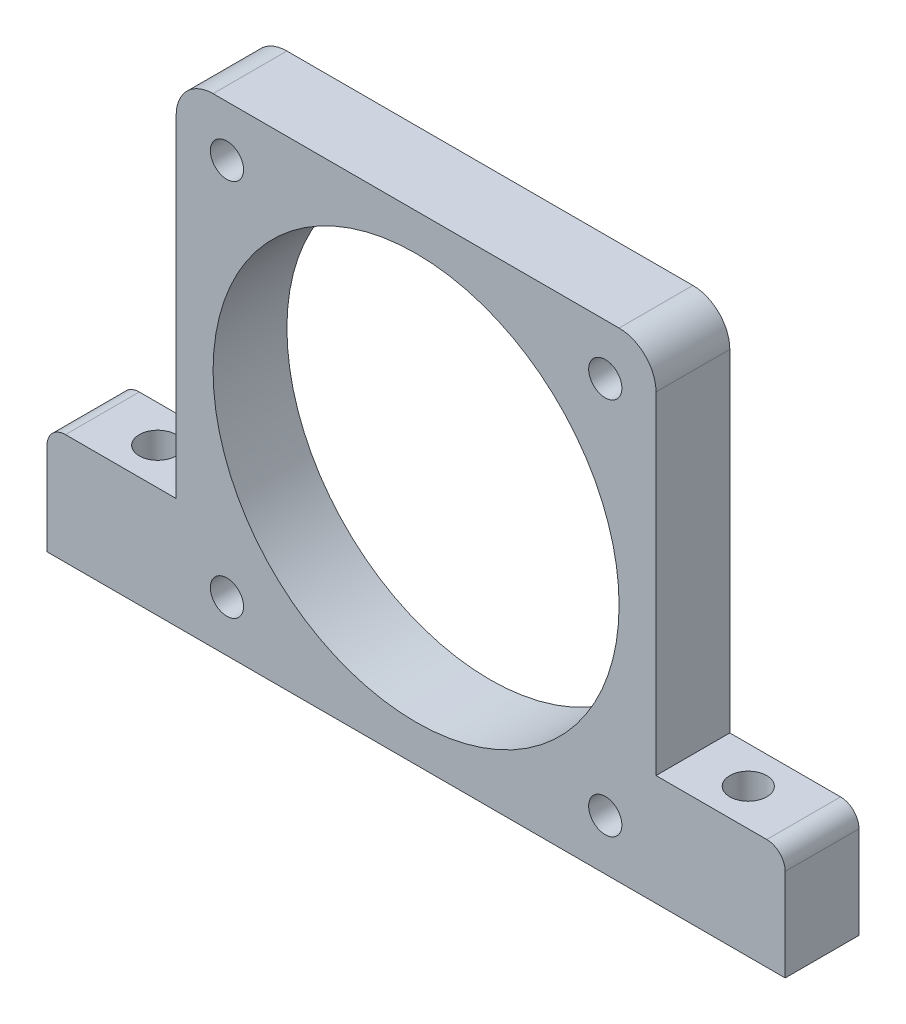
ISO-10303-21;
HEADER;
FILE_DESCRIPTION(('STEP AP214'),'2;1');
FILE_NAME('part.step','',(''),(''),'','','');
FILE_SCHEMA(('AUTOMOTIVE_DESIGN { 1 0 10303 214 1 1 1 1 }'));
ENDSEC;
DATA;
#1=APPLICATION_CONTEXT('core data for automotive mechanical design processes');
#2=APPLICATION_PROTOCOL_DEFINITION('international standard','automotive_design',2000,#1);
#3=PRODUCT_CONTEXT('',#1,'mechanical');
#4=PRODUCT('Part','Part','',(#3));
#5=PRODUCT_RELATED_PRODUCT_CATEGORY('part','',(#4));
#6=PRODUCT_DEFINITION_FORMATION('','',#4);
#7=PRODUCT_DEFINITION_CONTEXT('part definition',#1,'design');
#8=PRODUCT_DEFINITION('design','',#6,#7);
#9=PRODUCT_DEFINITION_SHAPE('','',#8);
#10=(LENGTH_UNIT() NAMED_UNIT(*) SI_UNIT(.MILLI.,.METRE.));
#11=(NAMED_UNIT(*) PLANE_ANGLE_UNIT() SI_UNIT($,.RADIAN.));
#12=(NAMED_UNIT(*) SI_UNIT($,.STERADIAN.) SOLID_ANGLE_UNIT());
#13=UNCERTAINTY_MEASURE_WITH_UNIT(LENGTH_MEASURE(1.E-05),#10,'distance_accuracy_value','');
#14=(GEOMETRIC_REPRESENTATION_CONTEXT(3) GLOBAL_UNCERTAINTY_ASSIGNED_CONTEXT((#13)) GLOBAL_UNIT_ASSIGNED_CONTEXT((#10,
#11,#12)) REPRESENTATION_CONTEXT('',''));
#15=CARTESIAN_POINT('',(0.,0.,0.));
#16=DIRECTION('',(0.,0.,1.));
#17=DIRECTION('',(1.,0.,0.));
#18=AXIS2_PLACEMENT_3D('',#15,#16,#17);
#19=CARTESIAN_POINT('',(65.,54.9999999999999,20.));
#20=DIRECTION('',(1.,0.,0.));
#21=DIRECTION('',(0.,1.,0.));
#22=AXIS2_PLACEMENT_3D('',#19,#20,#21);
#23=PLANE('',#22);
#24=DIRECTION('',(0.,-1.,0.));
#25=VECTOR('',#24,1.);
#26=CARTESIAN_POINT('',(65.,54.9999999999999,20.));
#27=LINE('',#26,#25);
#28=CARTESIAN_POINT('',(65.,54.9999999999999,20.));
#29=VERTEX_POINT('',#28);
#30=CARTESIAN_POINT('',(64.9999999999999,-35.,20.));
#31=VERTEX_POINT('',#30);
#32=EDGE_CURVE('E233',#29,#31,#27,.T.);
#33=ORIENTED_EDGE('',*,*,#32,.T.);
#34=DIRECTION('',(0.,0.,-1.));
#35=VECTOR('',#34,1.);
#36=CARTESIAN_POINT('',(64.9999999999999,-35.,20.));
#37=LINE('',#36,#35);
#38=CARTESIAN_POINT('',(64.9999999999999,-35.,0.));
#39=VERTEX_POINT('',#38);
#40=EDGE_CURVE('E178',#31,#39,#37,.T.);
#41=ORIENTED_EDGE('',*,*,#40,.T.);
#42=DIRECTION('',(0.,-1.,0.));
#43=VECTOR('',#42,1.);
#44=CARTESIAN_POINT('',(65.,54.9999999999999,0.));
#45=LINE('',#44,#43);
#46=CARTESIAN_POINT('',(65.,54.9999999999999,0.));
#47=VERTEX_POINT('',#46);
#48=EDGE_CURVE('E247',#47,#39,#45,.T.);
#49=ORIENTED_EDGE('',*,*,#48,.F.);
#50=DIRECTION('',(0.,0.,-1.));
#51=VECTOR('',#50,1.);
#52=CARTESIAN_POINT('',(65.,54.9999999999999,20.));
#53=LINE('',#52,#51);
#54=EDGE_CURVE('E45',#29,#47,#53,.T.);
#55=ORIENTED_EDGE('',*,*,#54,.F.);
#56=EDGE_LOOP('',(#33,#41,#49,#55));
#57=FACE_BOUND('',#56,.T.);
#58=ADVANCED_FACE('F36',(#57),#23,.T.);
#59=CARTESIAN_POINT('',(-55.,55.,20.));
#60=DIRECTION('',(0.,0.,-1.));
#61=DIRECTION('',(-1.,0.,0.));
#62=AXIS2_PLACEMENT_3D('',#59,#60,#61);
#63=CYLINDRICAL_SURFACE('',#62,10.);
#64=CARTESIAN_POINT('',(-55.,55.,0.));
#65=DIRECTION('',(0.,0.,-1.));
#66=DIRECTION('',(-1.,0.,0.));
#67=AXIS2_PLACEMENT_3D('',#64,#65,#66);
#68=CIRCLE('',#67,10.);
#69=CARTESIAN_POINT('',(-65.,55.,0.));
#70=VERTEX_POINT('',#69);
#71=CARTESIAN_POINT('',(-55.,65.,0.));
#72=VERTEX_POINT('',#71);
#73=EDGE_CURVE('E222',#70,#72,#68,.T.);
#74=ORIENTED_EDGE('',*,*,#73,.F.);
#75=DIRECTION('',(0.,0.,-1.));
#76=VECTOR('',#75,1.);
#77=CARTESIAN_POINT('',(-65.,55.,20.));
#78=LINE('',#77,#76);
#79=CARTESIAN_POINT('',(-65.,55.,20.));
#80=VERTEX_POINT('',#79);
#81=EDGE_CURVE('E11',#80,#70,#78,.T.);
#82=ORIENTED_EDGE('',*,*,#81,.F.);
#83=CARTESIAN_POINT('',(-55.,55.,20.));
#84=DIRECTION('',(0.,0.,-1.));
#85=DIRECTION('',(-1.,0.,0.));
#86=AXIS2_PLACEMENT_3D('',#83,#84,#85);
#87=CIRCLE('',#86,10.);
#88=CARTESIAN_POINT('',(-55.,65.,20.));
#89=VERTEX_POINT('',#88);
#90=EDGE_CURVE('E225',#80,#89,#87,.T.);
#91=ORIENTED_EDGE('',*,*,#90,.T.);
#92=DIRECTION('',(0.,0.,-1.));
#93=VECTOR('',#92,1.);
#94=CARTESIAN_POINT('',(-55.,65.,20.));
#95=LINE('',#94,#93);
#96=EDGE_CURVE('E40',#89,#72,#95,.T.);
#97=ORIENTED_EDGE('',*,*,#96,.T.);
#98=EDGE_LOOP('',(#74,#82,#91,#97));
#99=FACE_BOUND('',#98,.T.);
#100=ADVANCED_FACE('F38',(#99),#63,.T.);
#101=CARTESIAN_POINT('',(-65.,55.,20.));
#102=DIRECTION('',(1.,0.,0.));
#103=DIRECTION('',(0.,0.,-1.));
#104=AXIS2_PLACEMENT_3D('',#101,#102,#103);
#105=PLANE('',#104);
#106=DIRECTION('',(0.,-1.,0.));
#107=VECTOR('',#106,1.);
#108=CARTESIAN_POINT('',(-65.,55.,0.));
#109=LINE('',#108,#107);
#110=CARTESIAN_POINT('',(-65.,-35.,0.));
#111=VERTEX_POINT('',#110);
#112=EDGE_CURVE('E57',#70,#111,#109,.T.);
#113=ORIENTED_EDGE('',*,*,#112,.T.);
#114=DIRECTION('',(0.,0.,-1.));
#115=VECTOR('',#114,1.);
#116=CARTESIAN_POINT('',(-64.9999999999999,-35.,20.));
#117=LINE('',#116,#115);
#118=CARTESIAN_POINT('',(-65.,-35.,20.));
#119=VERTEX_POINT('',#118);
#120=EDGE_CURVE('E53',#119,#111,#117,.T.);
#121=ORIENTED_EDGE('',*,*,#120,.F.);
#122=DIRECTION('',(0.,-1.,0.));
#123=VECTOR('',#122,1.);
#124=CARTESIAN_POINT('',(-65.,55.,20.));
#125=LINE('',#124,#123);
#126=EDGE_CURVE('E144',#80,#119,#125,.T.);
#127=ORIENTED_EDGE('',*,*,#126,.F.);
#128=ORIENTED_EDGE('',*,*,#81,.T.);
#129=EDGE_LOOP('',(#113,#121,#127,#128));
#130=FACE_BOUND('',#129,.T.);
#131=ADVANCED_FACE('F298',(#130),#105,.F.);
#132=CARTESIAN_POINT('',(-65.,-65.,20.));
#133=DIRECTION('',(0.,1.,0.));
#134=DIRECTION('',(-1.,0.,0.));
#135=AXIS2_PLACEMENT_3D('',#132,#133,#134);
#136=PLANE('',#135);
#137=CARTESIAN_POINT('',(-79.9999999999999,-65.,10.));
#138=DIRECTION('',(0.,-1.,0.));
#139=DIRECTION('',(1.,0.,0.));
#140=AXIS2_PLACEMENT_3D('',#137,#138,#139);
#141=CIRCLE('',#140,5.);
#142=CARTESIAN_POINT('',(-84.9999999999999,-65.0000000000001,10.));
#143=VERTEX_POINT('',#142);
#144=EDGE_CURVE('E156',#143,#143,#141,.T.);
#145=ORIENTED_EDGE('',*,*,#144,.F.);
#146=EDGE_LOOP('',(#145));
#147=FACE_BOUND('',#146,.T.);
#148=CARTESIAN_POINT('',(79.9999999999999,-65.,10.));
#149=DIRECTION('',(0.,1.,0.));
#150=DIRECTION('',(-1.,0.,0.));
#151=AXIS2_PLACEMENT_3D('',#148,#149,#150);
#152=CIRCLE('',#151,5.);
#153=CARTESIAN_POINT('',(74.9999999999999,-65.,10.));
#154=VERTEX_POINT('',#153);
#155=EDGE_CURVE('E165',#154,#154,#152,.T.);
#156=ORIENTED_EDGE('',*,*,#155,.T.);
#157=EDGE_LOOP('',(#156));
#158=FACE_BOUND('',#157,.T.);
#159=DIRECTION('',(1.,0.,0.));
#160=VECTOR('',#159,1.);
#161=CARTESIAN_POINT('',(-65.,-65.,0.));
#162=LINE('',#161,#160);
#163=CARTESIAN_POINT('',(-99.9999999999999,-65.,0.));
#164=VERTEX_POINT('',#163);
#165=CARTESIAN_POINT('',(99.9999999999999,-65.,0.));
#166=VERTEX_POINT('',#165);
#167=EDGE_CURVE('E250',#164,#166,#162,.T.);
#168=ORIENTED_EDGE('',*,*,#167,.T.);
#169=DIRECTION('',(0.,0.,-1.));
#170=VECTOR('',#169,1.);
#171=CARTESIAN_POINT('',(99.9999999999999,-65.,20.));
#172=LINE('',#171,#170);
#173=CARTESIAN_POINT('',(99.9999999999999,-65.,20.));
#174=VERTEX_POINT('',#173);
#175=EDGE_CURVE('E191',#174,#166,#172,.T.);
#176=ORIENTED_EDGE('',*,*,#175,.F.);
#177=DIRECTION('',(1.,0.,0.));
#178=VECTOR('',#177,1.);
#179=CARTESIAN_POINT('',(-65.,-65.,20.));
#180=LINE('',#179,#178);
#181=CARTESIAN_POINT('',(-99.9999999999999,-65.,20.));
#182=VERTEX_POINT('',#181);
#183=EDGE_CURVE('E236',#182,#174,#180,.T.);
#184=ORIENTED_EDGE('',*,*,#183,.F.);
#185=DIRECTION('',(0.,0.,-1.));
#186=VECTOR('',#185,1.);
#187=CARTESIAN_POINT('',(-99.9999999999999,-65.,20.));
#188=LINE('',#187,#186);
#189=EDGE_CURVE('E150',#182,#164,#188,.T.);
#190=ORIENTED_EDGE('',*,*,#189,.T.);
#191=EDGE_LOOP('',(#168,#176,#184,#190));
#192=FACE_BOUND('',#191,.T.);
#193=ADVANCED_FACE('F273',(#147,#158,#192),#136,.F.);
#194=CARTESIAN_POINT('',(55.,55.,20.));
#195=DIRECTION('',(0.,0.,-1.));
#196=DIRECTION('',(-1.,0.,0.));
#197=AXIS2_PLACEMENT_3D('',#194,#195,#196);
#198=CYLINDRICAL_SURFACE('',#197,9.99999999999999);
#199=CARTESIAN_POINT('',(55.,55.,0.));
#200=DIRECTION('',(0.,0.,1.));
#201=DIRECTION('',(1.,0.,0.));
#202=AXIS2_PLACEMENT_3D('',#199,#200,#201);
#203=CIRCLE('',#202,9.99999999999999);
#204=CARTESIAN_POINT('',(54.9999999999999,65.,0.));
#205=VERTEX_POINT('',#204);
#206=EDGE_CURVE('E244',#47,#205,#203,.T.);
#207=ORIENTED_EDGE('',*,*,#206,.T.);
#208=DIRECTION('',(0.,0.,-1.));
#209=VECTOR('',#208,1.);
#210=CARTESIAN_POINT('',(54.9999999999999,65.,20.));
#211=LINE('',#210,#209);
#212=CARTESIAN_POINT('',(54.9999999999999,65.,20.));
#213=VERTEX_POINT('',#212);
#214=EDGE_CURVE('E253',#213,#205,#211,.T.);
#215=ORIENTED_EDGE('',*,*,#214,.F.);
#216=CARTESIAN_POINT('',(55.,55.,20.));
#217=DIRECTION('',(0.,0.,1.));
#218=DIRECTION('',(1.,0.,0.));
#219=AXIS2_PLACEMENT_3D('',#216,#217,#218);
#220=CIRCLE('',#219,9.99999999999999);
#221=EDGE_CURVE('E231',#29,#213,#220,.T.);
#222=ORIENTED_EDGE('',*,*,#221,.F.);
#223=ORIENTED_EDGE('',*,*,#54,.T.);
#224=EDGE_LOOP('',(#207,#215,#222,#223));
#225=FACE_BOUND('',#224,.T.);
#226=ADVANCED_FACE('F291',(#225),#198,.T.);
#227=CARTESIAN_POINT('',(-55.,65.,20.));
#228=DIRECTION('',(0.,1.,0.));
#229=DIRECTION('',(-1.,0.,0.));
#230=AXIS2_PLACEMENT_3D('',#227,#228,#229);
#231=PLANE('',#230);
#232=DIRECTION('',(1.,0.,0.));
#233=VECTOR('',#232,1.);
#234=CARTESIAN_POINT('',(-55.,65.,0.));
#235=LINE('',#234,#233);
#236=EDGE_CURVE('E241',#72,#205,#235,.T.);
#237=ORIENTED_EDGE('',*,*,#236,.F.);
#238=ORIENTED_EDGE('',*,*,#96,.F.);
#239=DIRECTION('',(1.,0.,0.));
#240=VECTOR('',#239,1.);
#241=CARTESIAN_POINT('',(-55.,65.,20.));
#242=LINE('',#241,#240);
#243=EDGE_CURVE('E228',#89,#213,#242,.T.);
#244=ORIENTED_EDGE('',*,*,#243,.T.);
#245=ORIENTED_EDGE('',*,*,#214,.T.);
#246=EDGE_LOOP('',(#237,#238,#244,#245));
#247=FACE_BOUND('',#246,.T.);
#248=ADVANCED_FACE('F260',(#247),#231,.T.);
#249=CARTESIAN_POINT('',(-55.,55.,20.));
#250=DIRECTION('',(0.,0.,-1.));
#251=DIRECTION('',(-1.,0.,0.));
#252=AXIS2_PLACEMENT_3D('',#249,#250,#251);
#253=PLANE('',#252);
#254=CARTESIAN_POINT('',(0.,0.,20.));
#255=DIRECTION('',(0.,0.,1.));
#256=DIRECTION('',(1.,0.,0.));
#257=AXIS2_PLACEMENT_3D('',#254,#255,#256);
#258=CIRCLE('',#257,55.);
#259=CARTESIAN_POINT('',(55.,0.,20.));
#260=VERTEX_POINT('',#259);
#261=EDGE_CURVE('E195',#260,#260,#258,.T.);
#262=ORIENTED_EDGE('',*,*,#261,.F.);
#263=EDGE_LOOP('',(#262));
#264=FACE_BOUND('',#263,.T.);
#265=CARTESIAN_POINT('',(51.25,-51.25,20.));
#266=DIRECTION('',(0.,0.,-1.));
#267=DIRECTION('',(1.,0.,0.));
#268=AXIS2_PLACEMENT_3D('',#265,#266,#267);
#269=CIRCLE('',#268,4.50000000000001);
#270=CARTESIAN_POINT('',(55.75,-51.25,20.));
#271=VERTEX_POINT('',#270);
#272=EDGE_CURVE('E201',#271,#271,#269,.T.);
#273=ORIENTED_EDGE('',*,*,#272,.T.);
#274=EDGE_LOOP('',(#273));
#275=FACE_BOUND('',#274,.T.);
#276=CARTESIAN_POINT('',(-51.25,-51.25,20.));
#277=DIRECTION('',(0.,0.,1.));
#278=DIRECTION('',(-1.,0.,0.));
#279=AXIS2_PLACEMENT_3D('',#276,#277,#278);
#280=CIRCLE('',#279,4.50000000000001);
#281=CARTESIAN_POINT('',(-55.75,-51.25,20.));
#282=VERTEX_POINT('',#281);
#283=EDGE_CURVE('E207',#282,#282,#280,.T.);
#284=ORIENTED_EDGE('',*,*,#283,.F.);
#285=EDGE_LOOP('',(#284));
#286=FACE_BOUND('',#285,.T.);
#287=CARTESIAN_POINT('',(-51.25,51.25,20.));
#288=DIRECTION('',(0.,0.,-1.));
#289=DIRECTION('',(-1.,0.,0.));
#290=AXIS2_PLACEMENT_3D('',#287,#288,#289);
#291=CIRCLE('',#290,4.50000000000001);
#292=CARTESIAN_POINT('',(-55.75,51.25,20.));
#293=VERTEX_POINT('',#292);
#294=EDGE_CURVE('E213',#293,#293,#291,.T.);
#295=ORIENTED_EDGE('',*,*,#294,.T.);
#296=EDGE_LOOP('',(#295));
#297=FACE_BOUND('',#296,.T.);
#298=CARTESIAN_POINT('',(51.25,51.25,20.));
#299=DIRECTION('',(0.,0.,1.));
#300=DIRECTION('',(1.,0.,0.));
#301=AXIS2_PLACEMENT_3D('',#298,#299,#300);
#302=CIRCLE('',#301,4.50000000000001);
#303=CARTESIAN_POINT('',(55.75,51.25,20.));
#304=VERTEX_POINT('',#303);
#305=EDGE_CURVE('E219',#304,#304,#302,.T.);
#306=ORIENTED_EDGE('',*,*,#305,.F.);
#307=EDGE_LOOP('',(#306));
#308=FACE_BOUND('',#307,.T.);
#309=ORIENTED_EDGE('',*,*,#90,.F.);
#310=ORIENTED_EDGE('',*,*,#126,.T.);
#311=DIRECTION('',(1.,0.,0.));
#312=VECTOR('',#311,1.);
#313=CARTESIAN_POINT('',(-64.9999999999999,-35.,20.));
#314=LINE('',#313,#312);
#315=CARTESIAN_POINT('',(-94.9999999999999,-35.,20.));
#316=VERTEX_POINT('',#315);
#317=EDGE_CURVE('E128',#316,#119,#314,.T.);
#318=ORIENTED_EDGE('',*,*,#317,.F.);
#319=CARTESIAN_POINT('',(-94.9999999999999,-40.,20.));
#320=DIRECTION('',(0.,0.,-1.));
#321=DIRECTION('',(-1.,0.,0.));
#322=AXIS2_PLACEMENT_3D('',#319,#320,#321);
#323=CIRCLE('',#322,5.00000000000001);
#324=CARTESIAN_POINT('',(-99.9999999999999,-40.,20.));
#325=VERTEX_POINT('',#324);
#326=EDGE_CURVE('E142',#325,#316,#323,.T.);
#327=ORIENTED_EDGE('',*,*,#326,.F.);
#328=DIRECTION('',(0.,1.,0.));
#329=VECTOR('',#328,1.);
#330=CARTESIAN_POINT('',(-99.9999999999999,-65.,20.));
#331=LINE('',#330,#329);
#332=EDGE_CURVE('E148',#182,#325,#331,.T.);
#333=ORIENTED_EDGE('',*,*,#332,.F.);
#334=ORIENTED_EDGE('',*,*,#183,.T.);
#335=DIRECTION('',(0.,1.,0.));
#336=VECTOR('',#335,1.);
#337=CARTESIAN_POINT('',(99.9999999999999,-65.,20.));
#338=LINE('',#337,#336);
#339=CARTESIAN_POINT('',(99.9999999999999,-40.,20.));
#340=VERTEX_POINT('',#339);
#341=EDGE_CURVE('E171',#174,#340,#338,.T.);
#342=ORIENTED_EDGE('',*,*,#341,.T.);
#343=CARTESIAN_POINT('',(94.9999999999999,-40.,20.));
#344=DIRECTION('',(0.,0.,1.));
#345=DIRECTION('',(1.,0.,0.));
#346=AXIS2_PLACEMENT_3D('',#343,#344,#345);
#347=CIRCLE('',#346,5.00000000000001);
#348=CARTESIAN_POINT('',(94.9999999999999,-35.,20.));
#349=VERTEX_POINT('',#348);
#350=EDGE_CURVE('E173',#340,#349,#347,.T.);
#351=ORIENTED_EDGE('',*,*,#350,.T.);
#352=DIRECTION('',(-1.,0.,0.));
#353=VECTOR('',#352,1.);
#354=CARTESIAN_POINT('',(64.9999999999999,-35.,20.));
#355=LINE('',#354,#353);
#356=EDGE_CURVE('E176',#349,#31,#355,.T.);
#357=ORIENTED_EDGE('',*,*,#356,.T.);
#358=ORIENTED_EDGE('',*,*,#32,.F.);
#359=ORIENTED_EDGE('',*,*,#221,.T.);
#360=ORIENTED_EDGE('',*,*,#243,.F.);
#361=EDGE_LOOP('',(#309,#310,#318,#327,#333,#334,#342,#351,#357,#358,#359,#360));
#362=FACE_BOUND('',#361,.T.);
#363=ADVANCED_FACE('F140',(#264,#275,#286,#297,#308,#362),#253,.F.);
#364=CARTESIAN_POINT('',(-55.,55.,0.));
#365=DIRECTION('',(0.,0.,-1.));
#366=DIRECTION('',(-1.,0.,0.));
#367=AXIS2_PLACEMENT_3D('',#364,#365,#366);
#368=PLANE('',#367);
#369=CARTESIAN_POINT('',(-59.84,-48.46,0.));
#370=DIRECTION('',(0.,0.,-1.));
#371=DIRECTION('',(-1.,0.,0.));
#372=AXIS2_PLACEMENT_3D('',#369,#370,#371);
#373=CIRCLE('',#372,2.5);
#374=CARTESIAN_POINT('',(-62.34,-48.46,0.));
#375=VERTEX_POINT('',#374);
#376=EDGE_CURVE('E378',#375,#375,#373,.T.);
#377=ORIENTED_EDGE('',*,*,#376,.F.);
#378=EDGE_LOOP('',(#377));
#379=FACE_BOUND('',#378,.T.);
#380=CARTESIAN_POINT('',(59.84,48.46,0.));
#381=DIRECTION('',(0.,0.,-1.));
#382=DIRECTION('',(-1.,0.,0.));
#383=AXIS2_PLACEMENT_3D('',#380,#381,#382);
#384=CIRCLE('',#383,2.5);
#385=CARTESIAN_POINT('',(57.34,48.46,0.));
#386=VERTEX_POINT('',#385);
#387=EDGE_CURVE('E387',#386,#386,#384,.T.);
#388=ORIENTED_EDGE('',*,*,#387,.F.);
#389=EDGE_LOOP('',(#388));
#390=FACE_BOUND('',#389,.T.);
#391=CARTESIAN_POINT('',(0.,0.,0.));
#392=DIRECTION('',(0.,0.,1.));
#393=DIRECTION('',(1.,0.,0.));
#394=AXIS2_PLACEMENT_3D('',#391,#392,#393);
#395=CIRCLE('',#394,55.);
#396=CARTESIAN_POINT('',(55.,0.,0.));
#397=VERTEX_POINT('',#396);
#398=EDGE_CURVE('E194',#397,#397,#395,.T.);
#399=ORIENTED_EDGE('',*,*,#398,.T.);
#400=EDGE_LOOP('',(#399));
#401=FACE_BOUND('',#400,.T.);
#402=CARTESIAN_POINT('',(51.25,-51.25,0.));
#403=DIRECTION('',(0.,0.,-1.));
#404=DIRECTION('',(1.,0.,0.));
#405=AXIS2_PLACEMENT_3D('',#402,#403,#404);
#406=CIRCLE('',#405,4.50000000000001);
#407=CARTESIAN_POINT('',(55.75,-51.25,0.));
#408=VERTEX_POINT('',#407);
#409=EDGE_CURVE('E198',#408,#408,#406,.T.);
#410=ORIENTED_EDGE('',*,*,#409,.F.);
#411=EDGE_LOOP('',(#410));
#412=FACE_BOUND('',#411,.T.);
#413=CARTESIAN_POINT('',(-51.25,-51.25,0.));
#414=DIRECTION('',(0.,0.,1.));
#415=DIRECTION('',(-1.,0.,0.));
#416=AXIS2_PLACEMENT_3D('',#413,#414,#415);
#417=CIRCLE('',#416,4.50000000000001);
#418=CARTESIAN_POINT('',(-55.75,-51.25,0.));
#419=VERTEX_POINT('',#418);
#420=EDGE_CURVE('E204',#419,#419,#417,.T.);
#421=ORIENTED_EDGE('',*,*,#420,.T.);
#422=EDGE_LOOP('',(#421));
#423=FACE_BOUND('',#422,.T.);
#424=CARTESIAN_POINT('',(-51.25,51.25,0.));
#425=DIRECTION('',(0.,0.,-1.));
#426=DIRECTION('',(-1.,0.,0.));
#427=AXIS2_PLACEMENT_3D('',#424,#425,#426);
#428=CIRCLE('',#427,4.50000000000001);
#429=CARTESIAN_POINT('',(-55.75,51.25,0.));
#430=VERTEX_POINT('',#429);
#431=EDGE_CURVE('E210',#430,#430,#428,.T.);
#432=ORIENTED_EDGE('',*,*,#431,.F.);
#433=EDGE_LOOP('',(#432));
#434=FACE_BOUND('',#433,.T.);
#435=CARTESIAN_POINT('',(51.25,51.25,0.));
#436=DIRECTION('',(0.,0.,1.));
#437=DIRECTION('',(1.,0.,0.));
#438=AXIS2_PLACEMENT_3D('',#435,#436,#437);
#439=CIRCLE('',#438,4.50000000000001);
#440=CARTESIAN_POINT('',(55.75,51.25,0.));
#441=VERTEX_POINT('',#440);
#442=EDGE_CURVE('E216',#441,#441,#439,.T.);
#443=ORIENTED_EDGE('',*,*,#442,.T.);
#444=EDGE_LOOP('',(#443));
#445=FACE_BOUND('',#444,.T.);
#446=ORIENTED_EDGE('',*,*,#73,.T.);
#447=ORIENTED_EDGE('',*,*,#236,.T.);
#448=ORIENTED_EDGE('',*,*,#206,.F.);
#449=ORIENTED_EDGE('',*,*,#48,.T.);
#450=DIRECTION('',(-1.,0.,0.));
#451=VECTOR('',#450,1.);
#452=CARTESIAN_POINT('',(64.9999999999999,-35.,0.));
#453=LINE('',#452,#451);
#454=CARTESIAN_POINT('',(94.9999999999999,-35.,0.));
#455=VERTEX_POINT('',#454);
#456=EDGE_CURVE('E174',#455,#39,#453,.T.);
#457=ORIENTED_EDGE('',*,*,#456,.F.);
#458=CARTESIAN_POINT('',(94.9999999999999,-40.,0.));
#459=DIRECTION('',(0.,0.,1.));
#460=DIRECTION('',(1.,0.,0.));
#461=AXIS2_PLACEMENT_3D('',#458,#459,#460);
#462=CIRCLE('',#461,5.00000000000001);
#463=CARTESIAN_POINT('',(99.9999999999999,-40.,0.));
#464=VERTEX_POINT('',#463);
#465=EDGE_CURVE('E180',#464,#455,#462,.T.);
#466=ORIENTED_EDGE('',*,*,#465,.F.);
#467=DIRECTION('',(0.,1.,0.));
#468=VECTOR('',#467,1.);
#469=CARTESIAN_POINT('',(99.9999999999999,-65.,0.));
#470=LINE('',#469,#468);
#471=EDGE_CURVE('E168',#166,#464,#470,.T.);
#472=ORIENTED_EDGE('',*,*,#471,.F.);
#473=ORIENTED_EDGE('',*,*,#167,.F.);
#474=DIRECTION('',(0.,1.,0.));
#475=VECTOR('',#474,1.);
#476=CARTESIAN_POINT('',(-99.9999999999999,-65.,0.));
#477=LINE('',#476,#475);
#478=CARTESIAN_POINT('',(-99.9999999999999,-40.,0.));
#479=VERTEX_POINT('',#478);
#480=EDGE_CURVE('E145',#164,#479,#477,.T.);
#481=ORIENTED_EDGE('',*,*,#480,.T.);
#482=CARTESIAN_POINT('',(-94.9999999999999,-40.,0.));
#483=DIRECTION('',(0.,0.,-1.));
#484=DIRECTION('',(-1.,0.,0.));
#485=AXIS2_PLACEMENT_3D('',#482,#483,#484);
#486=CIRCLE('',#485,5.00000000000001);
#487=CARTESIAN_POINT('',(-94.9999999999999,-35.,0.));
#488=VERTEX_POINT('',#487);
#489=EDGE_CURVE('E155',#479,#488,#486,.T.);
#490=ORIENTED_EDGE('',*,*,#489,.T.);
#491=DIRECTION('',(1.,0.,0.));
#492=VECTOR('',#491,1.);
#493=CARTESIAN_POINT('',(-64.9999999999999,-35.,0.));
#494=LINE('',#493,#492);
#495=EDGE_CURVE('E130',#488,#111,#494,.T.);
#496=ORIENTED_EDGE('',*,*,#495,.T.);
#497=ORIENTED_EDGE('',*,*,#112,.F.);
#498=EDGE_LOOP('',(#446,#447,#448,#449,#457,#466,#472,#473,#481,#490,#496,#497));
#499=FACE_BOUND('',#498,.T.);
#500=ADVANCED_FACE('F263',(#379,#390,#401,#412,#423,#434,#445,#499),#368,.T.);
#501=CARTESIAN_POINT('',(51.25,51.25,20.));
#502=DIRECTION('',(0.,0.,-1.));
#503=DIRECTION('',(-1.,0.,0.));
#504=AXIS2_PLACEMENT_3D('',#501,#502,#503);
#505=CYLINDRICAL_SURFACE('',#504,4.50000000000001);
#506=ORIENTED_EDGE('',*,*,#305,.T.);
#507=EDGE_LOOP('',(#506));
#508=FACE_BOUND('',#507,.T.);
#509=ORIENTED_EDGE('',*,*,#442,.F.);
#510=EDGE_LOOP('',(#509));
#511=FACE_BOUND('',#510,.T.);
#512=ADVANCED_FACE('F311',(#508,#511),#505,.F.);
#513=CARTESIAN_POINT('',(-51.25,51.25,20.));
#514=DIRECTION('',(0.,0.,-1.));
#515=DIRECTION('',(-1.,0.,0.));
#516=AXIS2_PLACEMENT_3D('',#513,#514,#515);
#517=CYLINDRICAL_SURFACE('',#516,4.50000000000001);
#518=ORIENTED_EDGE('',*,*,#294,.F.);
#519=EDGE_LOOP('',(#518));
#520=FACE_BOUND('',#519,.T.);
#521=ORIENTED_EDGE('',*,*,#431,.T.);
#522=EDGE_LOOP('',(#521));
#523=FACE_BOUND('',#522,.T.);
#524=ADVANCED_FACE('F318',(#520,#523),#517,.F.);
#525=CARTESIAN_POINT('',(-51.25,-51.25,20.));
#526=DIRECTION('',(0.,0.,-1.));
#527=DIRECTION('',(-1.,0.,0.));
#528=AXIS2_PLACEMENT_3D('',#525,#526,#527);
#529=CYLINDRICAL_SURFACE('',#528,4.50000000000001);
#530=ORIENTED_EDGE('',*,*,#283,.T.);
#531=EDGE_LOOP('',(#530));
#532=FACE_BOUND('',#531,.T.);
#533=ORIENTED_EDGE('',*,*,#420,.F.);
#534=EDGE_LOOP('',(#533));
#535=FACE_BOUND('',#534,.T.);
#536=ADVANCED_FACE('F322',(#532,#535),#529,.F.);
#537=CARTESIAN_POINT('',(51.25,-51.25,20.));
#538=DIRECTION('',(0.,0.,-1.));
#539=DIRECTION('',(-1.,0.,0.));
#540=AXIS2_PLACEMENT_3D('',#537,#538,#539);
#541=CYLINDRICAL_SURFACE('',#540,4.50000000000001);
#542=ORIENTED_EDGE('',*,*,#272,.F.);
#543=EDGE_LOOP('',(#542));
#544=FACE_BOUND('',#543,.T.);
#545=ORIENTED_EDGE('',*,*,#409,.T.);
#546=EDGE_LOOP('',(#545));
#547=FACE_BOUND('',#546,.T.);
#548=ADVANCED_FACE('F326',(#544,#547),#541,.F.);
#549=CARTESIAN_POINT('',(0.,0.,20.));
#550=DIRECTION('',(0.,0.,-1.));
#551=DIRECTION('',(-1.,0.,0.));
#552=AXIS2_PLACEMENT_3D('',#549,#550,#551);
#553=CYLINDRICAL_SURFACE('',#552,55.);
#554=ORIENTED_EDGE('',*,*,#261,.T.);
#555=EDGE_LOOP('',(#554));
#556=FACE_BOUND('',#555,.T.);
#557=ORIENTED_EDGE('',*,*,#398,.F.);
#558=EDGE_LOOP('',(#557));
#559=FACE_BOUND('',#558,.T.);
#560=ADVANCED_FACE('F330',(#556,#559),#553,.F.);
#561=CARTESIAN_POINT('',(99.9999999999999,-65.,20.));
#562=DIRECTION('',(-1.,0.,0.));
#563=DIRECTION('',(0.,-1.,0.));
#564=AXIS2_PLACEMENT_3D('',#561,#562,#563);
#565=PLANE('',#564);
#566=ORIENTED_EDGE('',*,*,#471,.T.);
#567=DIRECTION('',(0.,0.,-1.));
#568=VECTOR('',#567,1.);
#569=CARTESIAN_POINT('',(99.9999999999999,-40.,20.));
#570=LINE('',#569,#568);
#571=EDGE_CURVE('E188',#340,#464,#570,.T.);
#572=ORIENTED_EDGE('',*,*,#571,.F.);
#573=ORIENTED_EDGE('',*,*,#341,.F.);
#574=ORIENTED_EDGE('',*,*,#175,.T.);
#575=EDGE_LOOP('',(#566,#572,#573,#574));
#576=FACE_BOUND('',#575,.T.);
#577=ADVANCED_FACE('F275',(#576),#565,.F.);
#578=CARTESIAN_POINT('',(94.9999999999999,-40.,20.));
#579=DIRECTION('',(0.,0.,-1.));
#580=DIRECTION('',(-1.,0.,0.));
#581=AXIS2_PLACEMENT_3D('',#578,#579,#580);
#582=CYLINDRICAL_SURFACE('',#581,5.00000000000001);
#583=ORIENTED_EDGE('',*,*,#465,.T.);
#584=DIRECTION('',(0.,0.,-1.));
#585=VECTOR('',#584,1.);
#586=CARTESIAN_POINT('',(94.9999999999999,-35.,20.));
#587=LINE('',#586,#585);
#588=EDGE_CURVE('E185',#349,#455,#587,.T.);
#589=ORIENTED_EDGE('',*,*,#588,.F.);
#590=ORIENTED_EDGE('',*,*,#350,.F.);
#591=ORIENTED_EDGE('',*,*,#571,.T.);
#592=EDGE_LOOP('',(#583,#589,#590,#591));
#593=FACE_BOUND('',#592,.T.);
#594=ADVANCED_FACE('F280',(#593),#582,.T.);
#595=CARTESIAN_POINT('',(64.9999999999999,-35.,20.));
#596=DIRECTION('',(0.,-1.,0.));
#597=DIRECTION('',(0.,0.,-1.));
#598=AXIS2_PLACEMENT_3D('',#595,#596,#597);
#599=PLANE('',#598);
#600=CARTESIAN_POINT('',(79.9999999999999,-35.,10.));
#601=DIRECTION('',(0.,1.,0.));
#602=DIRECTION('',(-1.,0.,0.));
#603=AXIS2_PLACEMENT_3D('',#600,#601,#602);
#604=CIRCLE('',#603,5.);
#605=CARTESIAN_POINT('',(74.9999999999999,-35.,10.));
#606=VERTEX_POINT('',#605);
#607=EDGE_CURVE('E164',#606,#606,#604,.T.);
#608=ORIENTED_EDGE('',*,*,#607,.F.);
#609=EDGE_LOOP('',(#608));
#610=FACE_BOUND('',#609,.T.);
#611=ORIENTED_EDGE('',*,*,#456,.T.);
#612=ORIENTED_EDGE('',*,*,#40,.F.);
#613=ORIENTED_EDGE('',*,*,#356,.F.);
#614=ORIENTED_EDGE('',*,*,#588,.T.);
#615=EDGE_LOOP('',(#611,#612,#613,#614));
#616=FACE_BOUND('',#615,.T.);
#617=ADVANCED_FACE('F285',(#610,#616),#599,.F.);
#618=CARTESIAN_POINT('',(79.9999999999999,-65.,10.));
#619=DIRECTION('',(0.,1.,0.));
#620=DIRECTION('',(-1.,0.,0.));
#621=AXIS2_PLACEMENT_3D('',#618,#619,#620);
#622=CYLINDRICAL_SURFACE('',#621,5.);
#623=ORIENTED_EDGE('',*,*,#155,.F.);
#624=EDGE_LOOP('',(#623));
#625=FACE_BOUND('',#624,.T.);
#626=ORIENTED_EDGE('',*,*,#607,.T.);
#627=EDGE_LOOP('',(#626));
#628=FACE_BOUND('',#627,.T.);
#629=ADVANCED_FACE('F341',(#625,#628),#622,.F.);
#630=CARTESIAN_POINT('',(-64.9999999999999,-35.,20.));
#631=DIRECTION('',(0.,1.,0.));
#632=DIRECTION('',(-1.,0.,0.));
#633=AXIS2_PLACEMENT_3D('',#630,#631,#632);
#634=PLANE('',#633);
#635=CARTESIAN_POINT('',(-79.9999999999999,-35.,10.));
#636=DIRECTION('',(0.,-1.,0.));
#637=DIRECTION('',(1.,0.,0.));
#638=AXIS2_PLACEMENT_3D('',#635,#636,#637);
#639=CIRCLE('',#638,5.);
#640=CARTESIAN_POINT('',(-84.9999999999999,-35.,10.));
#641=VERTEX_POINT('',#640);
#642=EDGE_CURVE('E377',#641,#641,#639,.T.);
#643=ORIENTED_EDGE('',*,*,#642,.T.);
#644=EDGE_LOOP('',(#643));
#645=FACE_BOUND('',#644,.T.);
#646=ORIENTED_EDGE('',*,*,#495,.F.);
#647=DIRECTION('',(0.,0.,-1.));
#648=VECTOR('',#647,1.);
#649=CARTESIAN_POINT('',(-94.9999999999999,-35.,20.));
#650=LINE('',#649,#648);
#651=EDGE_CURVE('E125',#316,#488,#650,.T.);
#652=ORIENTED_EDGE('',*,*,#651,.F.);
#653=ORIENTED_EDGE('',*,*,#317,.T.);
#654=ORIENTED_EDGE('',*,*,#120,.T.);
#655=EDGE_LOOP('',(#646,#652,#653,#654));
#656=FACE_BOUND('',#655,.T.);
#657=ADVANCED_FACE('F127',(#645,#656),#634,.T.);
#658=CARTESIAN_POINT('',(-94.9999999999999,-40.,20.));
#659=DIRECTION('',(0.,0.,-1.));
#660=DIRECTION('',(-1.,0.,0.));
#661=AXIS2_PLACEMENT_3D('',#658,#659,#660);
#662=CYLINDRICAL_SURFACE('',#661,5.00000000000001);
#663=ORIENTED_EDGE('',*,*,#489,.F.);
#664=DIRECTION('',(0.,0.,-1.));
#665=VECTOR('',#664,1.);
#666=CARTESIAN_POINT('',(-99.9999999999999,-40.,20.));
#667=LINE('',#666,#665);
#668=EDGE_CURVE('E135',#325,#479,#667,.T.);
#669=ORIENTED_EDGE('',*,*,#668,.F.);
#670=ORIENTED_EDGE('',*,*,#326,.T.);
#671=ORIENTED_EDGE('',*,*,#651,.T.);
#672=EDGE_LOOP('',(#663,#669,#670,#671));
#673=FACE_BOUND('',#672,.T.);
#674=ADVANCED_FACE('F147',(#673),#662,.T.);
#675=CARTESIAN_POINT('',(-99.9999999999999,-65.,20.));
#676=DIRECTION('',(-1.,0.,0.));
#677=DIRECTION('',(0.,-1.,0.));
#678=AXIS2_PLACEMENT_3D('',#675,#676,#677);
#679=PLANE('',#678);
#680=ORIENTED_EDGE('',*,*,#480,.F.);
#681=ORIENTED_EDGE('',*,*,#189,.F.);
#682=ORIENTED_EDGE('',*,*,#332,.T.);
#683=ORIENTED_EDGE('',*,*,#668,.T.);
#684=EDGE_LOOP('',(#680,#681,#682,#683));
#685=FACE_BOUND('',#684,.T.);
#686=ADVANCED_FACE('F268',(#685),#679,.T.);
#687=CARTESIAN_POINT('',(-79.9999999999999,-65.,10.));
#688=DIRECTION('',(0.,1.,0.));
#689=DIRECTION('',(-1.,0.,0.));
#690=AXIS2_PLACEMENT_3D('',#687,#688,#689);
#691=CYLINDRICAL_SURFACE('',#690,5.);
#692=CARTESIAN_POINT('',(-84.9999999999999,-65.0000000000001,10.));
#693=CARTESIAN_POINT('',(-84.9999999999999,-64.6875000000001,10.));
#694=CARTESIAN_POINT('',(-84.9999999999999,-64.3750000000001,10.));
#695=CARTESIAN_POINT('',(-84.9999999999999,-63.75,10.));
#696=CARTESIAN_POINT('',(-84.9999999999999,-63.4375,10.));
#697=CARTESIAN_POINT('',(-84.9999999999999,-62.8125,10.));
#698=CARTESIAN_POINT('',(-84.9999999999999,-62.5,10.));
#699=CARTESIAN_POINT('',(-84.9999999999999,-61.875,10.));
#700=CARTESIAN_POINT('',(-84.9999999999999,-61.5625,10.));
#701=CARTESIAN_POINT('',(-84.9999999999999,-60.9375,10.));
#702=CARTESIAN_POINT('',(-84.9999999999999,-60.625,10.));
#703=CARTESIAN_POINT('',(-84.9999999999999,-60.,10.));
#704=CARTESIAN_POINT('',(-84.9999999999999,-59.6875,10.));
#705=CARTESIAN_POINT('',(-84.9999999999999,-59.0625,10.));
#706=CARTESIAN_POINT('',(-84.9999999999999,-58.75,10.));
#707=CARTESIAN_POINT('',(-84.9999999999999,-58.125,10.));
#708=CARTESIAN_POINT('',(-84.9999999999999,-57.8125,10.));
#709=CARTESIAN_POINT('',(-84.9999999999999,-57.1875,10.));
#710=CARTESIAN_POINT('',(-84.9999999999999,-56.875,10.));
#711=CARTESIAN_POINT('',(-84.9999999999999,-56.25,10.));
#712=CARTESIAN_POINT('',(-84.9999999999999,-55.9375,10.));
#713=CARTESIAN_POINT('',(-84.9999999999999,-55.3125,10.));
#714=CARTESIAN_POINT('',(-84.9999999999999,-55.,10.));
#715=CARTESIAN_POINT('',(-84.9999999999999,-54.375,10.));
#716=CARTESIAN_POINT('',(-84.9999999999999,-54.0625,10.));
#717=CARTESIAN_POINT('',(-84.9999999999999,-53.4375,10.));
#718=CARTESIAN_POINT('',(-84.9999999999999,-53.125,10.));
#719=CARTESIAN_POINT('',(-84.9999999999999,-52.5,10.));
#720=CARTESIAN_POINT('',(-84.9999999999999,-52.1875,10.));
#721=CARTESIAN_POINT('',(-84.9999999999999,-51.5625,10.));
#722=CARTESIAN_POINT('',(-84.9999999999999,-51.25,10.));
#723=CARTESIAN_POINT('',(-84.9999999999999,-50.625,10.));
#724=CARTESIAN_POINT('',(-84.9999999999999,-50.3125,10.));
#725=CARTESIAN_POINT('',(-84.9999999999999,-49.6875,10.));
#726=CARTESIAN_POINT('',(-84.9999999999999,-49.375,10.));
#727=CARTESIAN_POINT('',(-84.9999999999999,-48.75,10.));
#728=CARTESIAN_POINT('',(-84.9999999999999,-48.4375,10.));
#729=CARTESIAN_POINT('',(-84.9999999999999,-47.8125,10.));
#730=CARTESIAN_POINT('',(-84.9999999999999,-47.5,10.));
#731=CARTESIAN_POINT('',(-84.9999999999999,-46.875,10.));
#732=CARTESIAN_POINT('',(-84.9999999999999,-46.5625,10.));
#733=CARTESIAN_POINT('',(-84.9999999999999,-45.9375,10.));
#734=CARTESIAN_POINT('',(-84.9999999999999,-45.625,10.));
#735=CARTESIAN_POINT('',(-84.9999999999999,-45.,10.));
#736=CARTESIAN_POINT('',(-84.9999999999999,-44.6875,10.));
#737=CARTESIAN_POINT('',(-84.9999999999999,-44.0625,10.));
#738=CARTESIAN_POINT('',(-84.9999999999999,-43.75,10.));
#739=CARTESIAN_POINT('',(-84.9999999999999,-43.125,10.));
#740=CARTESIAN_POINT('',(-84.9999999999999,-42.8125,10.));
#741=CARTESIAN_POINT('',(-84.9999999999999,-42.1875,10.));
#742=CARTESIAN_POINT('',(-84.9999999999999,-41.875,10.));
#743=CARTESIAN_POINT('',(-84.9999999999999,-41.25,10.));
#744=CARTESIAN_POINT('',(-84.9999999999999,-40.9375,10.));
#745=CARTESIAN_POINT('',(-84.9999999999999,-40.3125,10.));
#746=CARTESIAN_POINT('',(-84.9999999999999,-40.,10.));
#747=CARTESIAN_POINT('',(-84.9999999999999,-39.375,10.));
#748=CARTESIAN_POINT('',(-84.9999999999999,-39.0625,10.));
#749=CARTESIAN_POINT('',(-84.9999999999999,-38.4375,10.));
#750=CARTESIAN_POINT('',(-84.9999999999999,-38.125,10.));
#751=CARTESIAN_POINT('',(-84.9999999999999,-37.5,10.));
#752=CARTESIAN_POINT('',(-84.9999999999999,-37.1875,10.));
#753=CARTESIAN_POINT('',(-84.9999999999999,-36.5625,10.));
#754=CARTESIAN_POINT('',(-84.9999999999999,-36.25,10.));
#755=CARTESIAN_POINT('',(-84.9999999999999,-35.625,10.));
#756=CARTESIAN_POINT('',(-84.9999999999999,-35.3125,10.));
#757=CARTESIAN_POINT('',(-84.9999999999999,-35.,10.));
#758=B_SPLINE_CURVE_WITH_KNOTS('',3,(#692,#693,#694,#695,#696,#697,#698,#699,#700,#701,#702,
#703,#704,#705,#706,#707,#708,#709,#710,#711,#712,#713,#714,#715,#716,#717,#718,#719,#720,#721,
#722,#723,#724,#725,#726,#727,#728,#729,#730,#731,#732,#733,#734,#735,#736,#737,#738,#739,#740,
#741,#742,#743,#744,#745,#746,#747,#748,#749,#750,#751,#752,#753,#754,#755,#756,#757),
.UNSPECIFIED.,.F.,.F.,(4,2,2,2,2,2,2,2,2,2,2,2,2,2,2,2,2,2,2,2,2,2,2,2,2,2,2,2,2,2,2,2,4),(0.,
0.937500000000008,1.87500000000002,2.81250000000001,3.75000000000001,4.68750000000001,
5.62500000000001,6.56250000000001,7.50000000000001,8.43750000000001,9.37500000000002,10.3125,
11.25,12.1875,13.125,14.0625,15.,15.9375,16.875,17.8125,18.75,19.6875,20.625,21.5625,22.5,
23.4375,24.375,25.3125,26.25,27.1875,28.125,29.0625,30.),.UNSPECIFIED.);
#759=EDGE_CURVE('BSEAM353',#143,#641,#758,.T.);
#760=ORIENTED_EDGE('',*,*,#144,.T.);
#761=ORIENTED_EDGE('',*,*,#642,.F.);
#762=ORIENTED_EDGE('',*,*,#759,.T.);
#763=ORIENTED_EDGE('',*,*,#759,.F.);
#764=EDGE_LOOP('',(#760,#762,#761,#763));
#765=FACE_BOUND('',#764,.T.);
#766=ADVANCED_FACE('F353',(#765),#691,.F.);
#767=CARTESIAN_POINT('',(59.84,48.46,10.));
#768=DIRECTION('',(0.,0.,-1.));
#769=DIRECTION('',(-1.,0.,0.));
#770=AXIS2_PLACEMENT_3D('',#767,#768,#769);
#771=CYLINDRICAL_SURFACE('',#770,2.5);
#772=CARTESIAN_POINT('',(59.84,48.46,10.));
#773=DIRECTION('',(0.,0.,-1.));
#774=DIRECTION('',(-1.,0.,0.));
#775=AXIS2_PLACEMENT_3D('',#772,#773,#774);
#776=CIRCLE('',#775,2.5);
#777=CARTESIAN_POINT('',(57.34,48.46,10.));
#778=VERTEX_POINT('',#777);
#779=EDGE_CURVE('E382',#778,#778,#776,.T.);
#780=ORIENTED_EDGE('',*,*,#779,.F.);
#781=EDGE_LOOP('',(#780));
#782=FACE_BOUND('',#781,.T.);
#783=ORIENTED_EDGE('',*,*,#387,.T.);
#784=EDGE_LOOP('',(#783));
#785=FACE_BOUND('',#784,.T.);
#786=ADVANCED_FACE('F356',(#782,#785),#771,.F.);
#787=CARTESIAN_POINT('',(59.84,48.46,10.));
#788=DIRECTION('',(0.,0.,-1.));
#789=DIRECTION('',(-1.,0.,0.));
#790=AXIS2_PLACEMENT_3D('',#787,#788,#789);
#791=PLANE('',#790);
#792=ORIENTED_EDGE('',*,*,#779,.T.);
#793=EDGE_LOOP('',(#792));
#794=FACE_BOUND('',#793,.T.);
#795=ADVANCED_FACE('F360',(#794),#791,.T.);
#796=CARTESIAN_POINT('',(-59.84,-48.46,10.));
#797=DIRECTION('',(0.,0.,-1.));
#798=DIRECTION('',(-1.,0.,0.));
#799=AXIS2_PLACEMENT_3D('',#796,#797,#798);
#800=CYLINDRICAL_SURFACE('',#799,2.5);
#801=CARTESIAN_POINT('',(-59.84,-48.46,10.));
#802=DIRECTION('',(0.,0.,-1.));
#803=DIRECTION('',(-1.,0.,0.));
#804=AXIS2_PLACEMENT_3D('',#801,#802,#803);
#805=CIRCLE('',#804,2.5);
#806=CARTESIAN_POINT('',(-62.34,-48.46,10.));
#807=VERTEX_POINT('',#806);
#808=EDGE_CURVE('E376',#807,#807,#805,.T.);
#809=ORIENTED_EDGE('',*,*,#808,.F.);
#810=EDGE_LOOP('',(#809));
#811=FACE_BOUND('',#810,.T.);
#812=ORIENTED_EDGE('',*,*,#376,.T.);
#813=EDGE_LOOP('',(#812));
#814=FACE_BOUND('',#813,.T.);
#815=ADVANCED_FACE('F364',(#811,#814),#800,.F.);
#816=CARTESIAN_POINT('',(-59.84,-48.46,10.));
#817=DIRECTION('',(0.,0.,-1.));
#818=DIRECTION('',(-1.,0.,0.));
#819=AXIS2_PLACEMENT_3D('',#816,#817,#818);
#820=PLANE('',#819);
#821=ORIENTED_EDGE('',*,*,#808,.T.);
#822=EDGE_LOOP('',(#821));
#823=FACE_BOUND('',#822,.T.);
#824=ADVANCED_FACE('F368',(#823),#820,.T.);
#825=CLOSED_SHELL('',(#58,#100,#131,#193,#226,#248,#363,#500,#512,#524,#536,#548,#560,#577,#594,
#617,#629,#657,#674,#686,#766,#786,#795,#815,#824));
#826=MANIFOLD_SOLID_BREP('B2',#825);
#827=ADVANCED_BREP_SHAPE_REPRESENTATION('',(#18,#826),#14);
#828=SHAPE_DEFINITION_REPRESENTATION(#9,#827);
ENDSEC;
END-ISO-10303-21;
